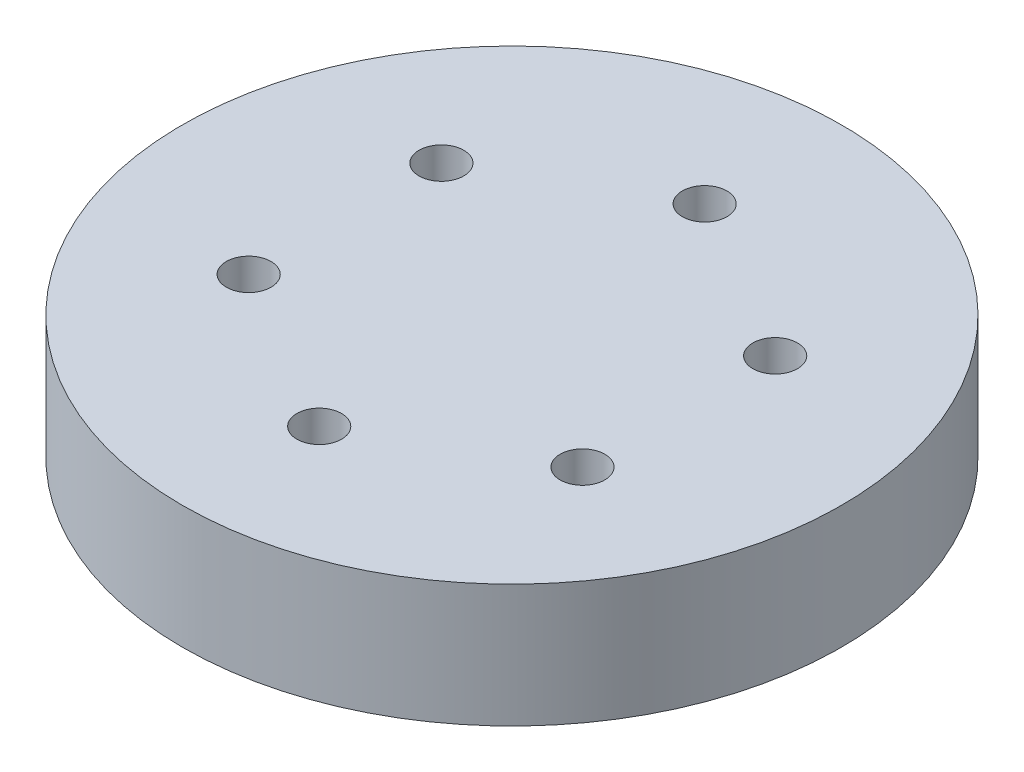
ISO-10303-21;
HEADER;
FILE_DESCRIPTION(('STEP AP214'),'2;1');
FILE_NAME('part.step','',(''),(''),'','','');
FILE_SCHEMA(('AUTOMOTIVE_DESIGN { 1 0 10303 214 1 1 1 1 }'));
ENDSEC;
DATA;
#1=APPLICATION_CONTEXT('core data for automotive mechanical design processes');
#2=APPLICATION_PROTOCOL_DEFINITION('international standard','automotive_design',2000,#1);
#3=PRODUCT_CONTEXT('',#1,'mechanical');
#4=PRODUCT('Part','Part','',(#3));
#5=PRODUCT_RELATED_PRODUCT_CATEGORY('part','',(#4));
#6=PRODUCT_DEFINITION_FORMATION('','',#4);
#7=PRODUCT_DEFINITION_CONTEXT('part definition',#1,'design');
#8=PRODUCT_DEFINITION('design','',#6,#7);
#9=PRODUCT_DEFINITION_SHAPE('','',#8);
#10=(LENGTH_UNIT() NAMED_UNIT(*) SI_UNIT(.MILLI.,.METRE.));
#11=(NAMED_UNIT(*) PLANE_ANGLE_UNIT() SI_UNIT($,.RADIAN.));
#12=(NAMED_UNIT(*) SI_UNIT($,.STERADIAN.) SOLID_ANGLE_UNIT());
#13=UNCERTAINTY_MEASURE_WITH_UNIT(LENGTH_MEASURE(1.E-05),#10,'distance_accuracy_value','');
#14=(GEOMETRIC_REPRESENTATION_CONTEXT(3) GLOBAL_UNCERTAINTY_ASSIGNED_CONTEXT((#13)) GLOBAL_UNIT_ASSIGNED_CONTEXT((#10,
#11,#12)) REPRESENTATION_CONTEXT('',''));
#15=CARTESIAN_POINT('',(0.,0.,0.));
#16=DIRECTION('',(0.,0.,1.));
#17=DIRECTION('',(1.,0.,0.));
#18=AXIS2_PLACEMENT_3D('',#15,#16,#17);
#19=CARTESIAN_POINT('',(0.,11.,0.));
#20=DIRECTION('',(0.,1.,0.));
#21=DIRECTION('',(0.,0.,1.));
#22=AXIS2_PLACEMENT_3D('',#19,#20,#21);
#23=PLANE('',#22);
#24=CARTESIAN_POINT('',(-14.9389382152805,11.,8.62500000000064));
#25=DIRECTION('',(0.,1.,0.));
#26=DIRECTION('',(0.,0.,1.));
#27=AXIS2_PLACEMENT_3D('',#24,#25,#26);
#28=CIRCLE('',#27,2.00000000000139);
#29=CARTESIAN_POINT('',(-14.9389382152805,11.,10.625000000002));
#30=VERTEX_POINT('',#29);
#31=EDGE_CURVE('E80',#30,#30,#28,.T.);
#32=ORIENTED_EDGE('',*,*,#31,.F.);
#33=EDGE_LOOP('',(#32));
#34=FACE_BOUND('',#33,.T.);
#35=CARTESIAN_POINT('',(14.9389382152827,11.,8.62499999999936));
#36=DIRECTION('',(0.,1.,0.));
#37=DIRECTION('',(0.,0.,1.));
#38=AXIS2_PLACEMENT_3D('',#35,#36,#37);
#39=CIRCLE('',#38,2.00000000000095);
#40=CARTESIAN_POINT('',(14.9389382152827,11.,10.6250000000003));
#41=VERTEX_POINT('',#40);
#42=EDGE_CURVE('E64',#41,#41,#39,.T.);
#43=ORIENTED_EDGE('',*,*,#42,.F.);
#44=EDGE_LOOP('',(#43));
#45=FACE_BOUND('',#44,.T.);
#46=CARTESIAN_POINT('',(0.,11.,-17.25));
#47=DIRECTION('',(0.,1.,0.));
#48=DIRECTION('',(0.,0.,1.));
#49=AXIS2_PLACEMENT_3D('',#46,#47,#48);
#50=CIRCLE('',#49,2.);
#51=CARTESIAN_POINT('',(0.,11.,-15.25));
#52=VERTEX_POINT('',#51);
#53=EDGE_CURVE('E50',#52,#52,#50,.T.);
#54=ORIENTED_EDGE('',*,*,#53,.F.);
#55=EDGE_LOOP('',(#54));
#56=FACE_BOUND('',#55,.T.);
#57=CARTESIAN_POINT('',(0.,11.,0.));
#58=DIRECTION('',(0.,1.,0.));
#59=DIRECTION('',(0.,0.,1.));
#60=AXIS2_PLACEMENT_3D('',#57,#58,#59);
#61=CIRCLE('',#60,29.5);
#62=CARTESIAN_POINT('',(0.,11.,29.5));
#63=VERTEX_POINT('',#62);
#64=EDGE_CURVE('E10',#63,#63,#61,.T.);
#65=ORIENTED_EDGE('',*,*,#64,.T.);
#66=EDGE_LOOP('',(#65));
#67=FACE_BOUND('',#66,.T.);
#68=CARTESIAN_POINT('',(14.9389382152819,11.,-8.62500000000064));
#69=DIRECTION('',(0.,1.,0.));
#70=DIRECTION('',(0.,0.,1.));
#71=AXIS2_PLACEMENT_3D('',#68,#69,#70);
#72=CIRCLE('',#71,2.0000000000002);
#73=CARTESIAN_POINT('',(14.9389382152819,11.,-6.62500000000043));
#74=VERTEX_POINT('',#73);
#75=EDGE_CURVE('E56',#74,#74,#72,.T.);
#76=ORIENTED_EDGE('',*,*,#75,.F.);
#77=EDGE_LOOP('',(#76));
#78=FACE_BOUND('',#77,.T.);
#79=CARTESIAN_POINT('',(1.46448591583782E-12,11.,17.25));
#80=DIRECTION('',(0.,1.,0.));
#81=DIRECTION('',(0.,0.,1.));
#82=AXIS2_PLACEMENT_3D('',#79,#80,#81);
#83=CIRCLE('',#82,2.00000000000151);
#84=CARTESIAN_POINT('',(1.46448591583782E-12,11.,19.2500000000015));
#85=VERTEX_POINT('',#84);
#86=EDGE_CURVE('E72',#85,#85,#83,.T.);
#87=ORIENTED_EDGE('',*,*,#86,.F.);
#88=EDGE_LOOP('',(#87));
#89=FACE_BOUND('',#88,.T.);
#90=CARTESIAN_POINT('',(-14.9389382152812,11.,-8.62499999999936));
#91=DIRECTION('',(0.,1.,0.));
#92=DIRECTION('',(0.,0.,1.));
#93=AXIS2_PLACEMENT_3D('',#90,#91,#92);
#94=CIRCLE('',#93,2.00000000000074);
#95=CARTESIAN_POINT('',(-14.9389382152812,11.,-6.62499999999861));
#96=VERTEX_POINT('',#95);
#97=EDGE_CURVE('E88',#96,#96,#94,.T.);
#98=ORIENTED_EDGE('',*,*,#97,.F.);
#99=EDGE_LOOP('',(#98));
#100=FACE_BOUND('',#99,.T.);
#101=ADVANCED_FACE('F37',(#34,#45,#56,#67,#78,#89,#100),#23,.T.);
#102=CARTESIAN_POINT('',(0.,0.,0.));
#103=DIRECTION('',(0.,1.,0.));
#104=DIRECTION('',(0.,0.,1.));
#105=AXIS2_PLACEMENT_3D('',#102,#103,#104);
#106=PLANE('',#105);
#107=CARTESIAN_POINT('',(0.,0.,0.));
#108=DIRECTION('',(0.,1.,0.));
#109=DIRECTION('',(0.,0.,1.));
#110=AXIS2_PLACEMENT_3D('',#107,#108,#109);
#111=CIRCLE('',#110,29.5);
#112=CARTESIAN_POINT('',(0.,0.,29.5));
#113=VERTEX_POINT('',#112);
#114=EDGE_CURVE('E41',#113,#113,#111,.T.);
#115=ORIENTED_EDGE('',*,*,#114,.F.);
#116=EDGE_LOOP('',(#115));
#117=FACE_BOUND('',#116,.T.);
#118=CARTESIAN_POINT('',(0.,0.,-17.25));
#119=DIRECTION('',(0.,1.,0.));
#120=DIRECTION('',(0.,0.,1.));
#121=AXIS2_PLACEMENT_3D('',#118,#119,#120);
#122=CIRCLE('',#121,2.);
#123=CARTESIAN_POINT('',(0.,0.,-15.25));
#124=VERTEX_POINT('',#123);
#125=EDGE_CURVE('E52',#124,#124,#122,.T.);
#126=ORIENTED_EDGE('',*,*,#125,.T.);
#127=EDGE_LOOP('',(#126));
#128=FACE_BOUND('',#127,.T.);
#129=CARTESIAN_POINT('',(14.9389382152819,0.,-8.62500000000064));
#130=DIRECTION('',(0.,1.,0.));
#131=DIRECTION('',(0.,0.,1.));
#132=AXIS2_PLACEMENT_3D('',#129,#130,#131);
#133=CIRCLE('',#132,2.0000000000002);
#134=CARTESIAN_POINT('',(14.9389382152819,0.,-6.62500000000043));
#135=VERTEX_POINT('',#134);
#136=EDGE_CURVE('E60',#135,#135,#133,.T.);
#137=ORIENTED_EDGE('',*,*,#136,.T.);
#138=EDGE_LOOP('',(#137));
#139=FACE_BOUND('',#138,.T.);
#140=CARTESIAN_POINT('',(14.9389382152827,0.,8.62499999999936));
#141=DIRECTION('',(0.,1.,0.));
#142=DIRECTION('',(0.,0.,1.));
#143=AXIS2_PLACEMENT_3D('',#140,#141,#142);
#144=CIRCLE('',#143,2.00000000000095);
#145=CARTESIAN_POINT('',(14.9389382152827,0.,10.6250000000003));
#146=VERTEX_POINT('',#145);
#147=EDGE_CURVE('E68',#146,#146,#144,.T.);
#148=ORIENTED_EDGE('',*,*,#147,.T.);
#149=EDGE_LOOP('',(#148));
#150=FACE_BOUND('',#149,.T.);
#151=CARTESIAN_POINT('',(1.46448591583782E-12,0.,17.25));
#152=DIRECTION('',(0.,1.,0.));
#153=DIRECTION('',(0.,0.,1.));
#154=AXIS2_PLACEMENT_3D('',#151,#152,#153);
#155=CIRCLE('',#154,2.00000000000151);
#156=CARTESIAN_POINT('',(1.46448591583782E-12,0.,19.2500000000015));
#157=VERTEX_POINT('',#156);
#158=EDGE_CURVE('E76',#157,#157,#155,.T.);
#159=ORIENTED_EDGE('',*,*,#158,.T.);
#160=EDGE_LOOP('',(#159));
#161=FACE_BOUND('',#160,.T.);
#162=CARTESIAN_POINT('',(-14.9389382152805,0.,8.62500000000064));
#163=DIRECTION('',(0.,1.,0.));
#164=DIRECTION('',(0.,0.,1.));
#165=AXIS2_PLACEMENT_3D('',#162,#163,#164);
#166=CIRCLE('',#165,2.00000000000139);
#167=CARTESIAN_POINT('',(-14.9389382152805,0.,10.625000000002));
#168=VERTEX_POINT('',#167);
#169=EDGE_CURVE('E84',#168,#168,#166,.T.);
#170=ORIENTED_EDGE('',*,*,#169,.T.);
#171=EDGE_LOOP('',(#170));
#172=FACE_BOUND('',#171,.T.);
#173=CARTESIAN_POINT('',(-14.9389382152812,0.,-8.62499999999936));
#174=DIRECTION('',(0.,1.,0.));
#175=DIRECTION('',(0.,0.,1.));
#176=AXIS2_PLACEMENT_3D('',#173,#174,#175);
#177=CIRCLE('',#176,2.00000000000074);
#178=CARTESIAN_POINT('',(-14.9389382152812,0.,-6.62499999999861));
#179=VERTEX_POINT('',#178);
#180=EDGE_CURVE('E92',#179,#179,#177,.T.);
#181=ORIENTED_EDGE('',*,*,#180,.T.);
#182=EDGE_LOOP('',(#181));
#183=FACE_BOUND('',#182,.T.);
#184=ADVANCED_FACE('F104',(#117,#128,#139,#150,#161,#172,#183),#106,.F.);
#185=CARTESIAN_POINT('',(0.,11.,0.));
#186=DIRECTION('',(0.,-1.,0.));
#187=DIRECTION('',(0.,0.,-1.));
#188=AXIS2_PLACEMENT_3D('',#185,#186,#187);
#189=CYLINDRICAL_SURFACE('',#188,29.5);
#190=ORIENTED_EDGE('',*,*,#64,.F.);
#191=EDGE_LOOP('',(#190));
#192=FACE_BOUND('',#191,.T.);
#193=ORIENTED_EDGE('',*,*,#114,.T.);
#194=EDGE_LOOP('',(#193));
#195=FACE_BOUND('',#194,.T.);
#196=ADVANCED_FACE('F39',(#192,#195),#189,.T.);
#197=CARTESIAN_POINT('',(0.,11.,-17.25));
#198=DIRECTION('',(0.,-1.,0.));
#199=DIRECTION('',(0.,0.,-1.));
#200=AXIS2_PLACEMENT_3D('',#197,#198,#199);
#201=CYLINDRICAL_SURFACE('',#200,2.);
#202=ORIENTED_EDGE('',*,*,#53,.T.);
#203=EDGE_LOOP('',(#202));
#204=FACE_BOUND('',#203,.T.);
#205=ORIENTED_EDGE('',*,*,#125,.F.);
#206=EDGE_LOOP('',(#205));
#207=FACE_BOUND('',#206,.T.);
#208=ADVANCED_FACE('F114',(#204,#207),#201,.F.);
#209=CARTESIAN_POINT('',(14.9389382152819,11.,-8.62500000000064));
#210=DIRECTION('',(0.,-1.,0.));
#211=DIRECTION('',(0.,0.,-1.));
#212=AXIS2_PLACEMENT_3D('',#209,#210,#211);
#213=CYLINDRICAL_SURFACE('',#212,2.0000000000002);
#214=ORIENTED_EDGE('',*,*,#75,.T.);
#215=EDGE_LOOP('',(#214));
#216=FACE_BOUND('',#215,.T.);
#217=ORIENTED_EDGE('',*,*,#136,.F.);
#218=EDGE_LOOP('',(#217));
#219=FACE_BOUND('',#218,.T.);
#220=ADVANCED_FACE('F117',(#216,#219),#213,.F.);
#221=CARTESIAN_POINT('',(14.9389382152827,11.,8.62499999999936));
#222=DIRECTION('',(0.,-1.,0.));
#223=DIRECTION('',(0.,0.,-1.));
#224=AXIS2_PLACEMENT_3D('',#221,#222,#223);
#225=CYLINDRICAL_SURFACE('',#224,2.00000000000095);
#226=ORIENTED_EDGE('',*,*,#42,.T.);
#227=EDGE_LOOP('',(#226));
#228=FACE_BOUND('',#227,.T.);
#229=ORIENTED_EDGE('',*,*,#147,.F.);
#230=EDGE_LOOP('',(#229));
#231=FACE_BOUND('',#230,.T.);
#232=ADVANCED_FACE('F121',(#228,#231),#225,.F.);
#233=CARTESIAN_POINT('',(1.46448591583782E-12,11.,17.25));
#234=DIRECTION('',(0.,-1.,0.));
#235=DIRECTION('',(0.,0.,-1.));
#236=AXIS2_PLACEMENT_3D('',#233,#234,#235);
#237=CYLINDRICAL_SURFACE('',#236,2.00000000000151);
#238=ORIENTED_EDGE('',*,*,#86,.T.);
#239=EDGE_LOOP('',(#238));
#240=FACE_BOUND('',#239,.T.);
#241=ORIENTED_EDGE('',*,*,#158,.F.);
#242=EDGE_LOOP('',(#241));
#243=FACE_BOUND('',#242,.T.);
#244=ADVANCED_FACE('F125',(#240,#243),#237,.F.);
#245=CARTESIAN_POINT('',(-14.9389382152805,11.,8.62500000000064));
#246=DIRECTION('',(0.,-1.,0.));
#247=DIRECTION('',(0.,0.,-1.));
#248=AXIS2_PLACEMENT_3D('',#245,#246,#247);
#249=CYLINDRICAL_SURFACE('',#248,2.00000000000139);
#250=ORIENTED_EDGE('',*,*,#31,.T.);
#251=EDGE_LOOP('',(#250));
#252=FACE_BOUND('',#251,.T.);
#253=ORIENTED_EDGE('',*,*,#169,.F.);
#254=EDGE_LOOP('',(#253));
#255=FACE_BOUND('',#254,.T.);
#256=ADVANCED_FACE('F129',(#252,#255),#249,.F.);
#257=CARTESIAN_POINT('',(-14.9389382152812,11.,-8.62499999999936));
#258=DIRECTION('',(0.,-1.,0.));
#259=DIRECTION('',(0.,0.,-1.));
#260=AXIS2_PLACEMENT_3D('',#257,#258,#259);
#261=CYLINDRICAL_SURFACE('',#260,2.00000000000074);
#262=ORIENTED_EDGE('',*,*,#97,.T.);
#263=EDGE_LOOP('',(#262));
#264=FACE_BOUND('',#263,.T.);
#265=ORIENTED_EDGE('',*,*,#180,.F.);
#266=EDGE_LOOP('',(#265));
#267=FACE_BOUND('',#266,.T.);
#268=ADVANCED_FACE('F100',(#264,#267),#261,.F.);
#269=CLOSED_SHELL('',(#101,#184,#196,#208,#220,#232,#244,#256,#268));
#270=MANIFOLD_SOLID_BREP('B2',#269);
#271=ADVANCED_BREP_SHAPE_REPRESENTATION('',(#18,#270),#14);
#272=SHAPE_DEFINITION_REPRESENTATION(#9,#271);
ENDSEC;
END-ISO-10303-21;
